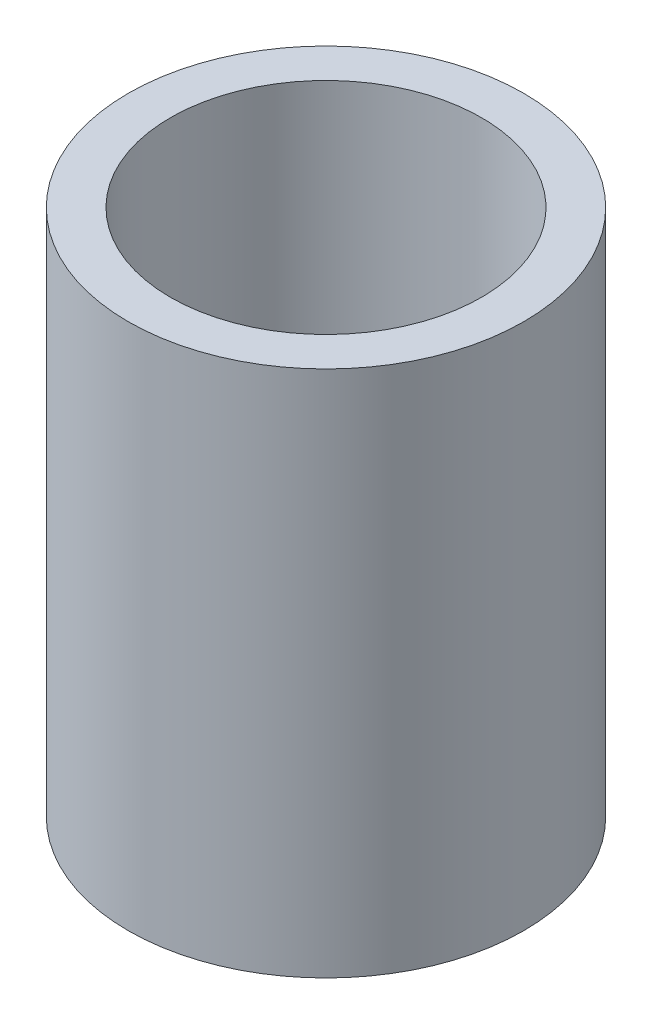
ISO-10303-21;
HEADER;
FILE_DESCRIPTION(('STEP AP214'),'2;1');
FILE_NAME('part.step','',(''),(''),'','','');
FILE_SCHEMA(('AUTOMOTIVE_DESIGN { 1 0 10303 214 1 1 1 1 }'));
ENDSEC;
DATA;
#1=APPLICATION_CONTEXT('core data for automotive mechanical design processes');
#2=APPLICATION_PROTOCOL_DEFINITION('international standard','automotive_design',2000,#1);
#3=PRODUCT_CONTEXT('',#1,'mechanical');
#4=PRODUCT('Part','Part','',(#3));
#5=PRODUCT_RELATED_PRODUCT_CATEGORY('part','',(#4));
#6=PRODUCT_DEFINITION_FORMATION('','',#4);
#7=PRODUCT_DEFINITION_CONTEXT('part definition',#1,'design');
#8=PRODUCT_DEFINITION('design','',#6,#7);
#9=PRODUCT_DEFINITION_SHAPE('','',#8);
#10=(LENGTH_UNIT() NAMED_UNIT(*) SI_UNIT(.MILLI.,.METRE.));
#11=(NAMED_UNIT(*) PLANE_ANGLE_UNIT() SI_UNIT($,.RADIAN.));
#12=(NAMED_UNIT(*) SI_UNIT($,.STERADIAN.) SOLID_ANGLE_UNIT());
#13=UNCERTAINTY_MEASURE_WITH_UNIT(LENGTH_MEASURE(1.E-05),#10,'distance_accuracy_value','');
#14=(GEOMETRIC_REPRESENTATION_CONTEXT(3) GLOBAL_UNCERTAINTY_ASSIGNED_CONTEXT((#13)) GLOBAL_UNIT_ASSIGNED_CONTEXT((#10,
#11,#12)) REPRESENTATION_CONTEXT('',''));
#15=CARTESIAN_POINT('',(0.,0.,0.));
#16=DIRECTION('',(0.,0.,1.));
#17=DIRECTION('',(1.,0.,0.));
#18=AXIS2_PLACEMENT_3D('',#15,#16,#17);
#19=CARTESIAN_POINT('',(0.,5.08,0.));
#20=DIRECTION('',(0.,1.,0.));
#21=DIRECTION('',(0.,0.,1.));
#22=AXIS2_PLACEMENT_3D('',#19,#20,#21);
#23=PLANE('',#22);
#24=CARTESIAN_POINT('',(0.,5.08,0.));
#25=DIRECTION('',(0.,1.,0.));
#26=DIRECTION('',(0.,0.,1.));
#27=AXIS2_PLACEMENT_3D('',#24,#25,#26);
#28=CIRCLE('',#27,1.905);
#29=CARTESIAN_POINT('',(0.,5.08,1.905));
#30=VERTEX_POINT('',#29);
#31=EDGE_CURVE('E10',#30,#30,#28,.T.);
#32=ORIENTED_EDGE('',*,*,#31,.T.);
#33=EDGE_LOOP('',(#32));
#34=FACE_BOUND('',#33,.T.);
#35=CARTESIAN_POINT('',(0.,5.08,0.));
#36=DIRECTION('',(0.,1.,0.));
#37=DIRECTION('',(0.,0.,1.));
#38=AXIS2_PLACEMENT_3D('',#35,#36,#37);
#39=CIRCLE('',#38,1.4986);
#40=CARTESIAN_POINT('',(0.,5.08,1.4986));
#41=VERTEX_POINT('',#40);
#42=EDGE_CURVE('E42',#41,#41,#39,.T.);
#43=ORIENTED_EDGE('',*,*,#42,.F.);
#44=EDGE_LOOP('',(#43));
#45=FACE_BOUND('',#44,.T.);
#46=ADVANCED_FACE('F31',(#34,#45),#23,.T.);
#47=CARTESIAN_POINT('',(0.,0.,0.));
#48=DIRECTION('',(0.,1.,0.));
#49=DIRECTION('',(0.,0.,1.));
#50=AXIS2_PLACEMENT_3D('',#47,#48,#49);
#51=PLANE('',#50);
#52=CARTESIAN_POINT('',(0.,0.,0.));
#53=DIRECTION('',(0.,1.,0.));
#54=DIRECTION('',(0.,0.,1.));
#55=AXIS2_PLACEMENT_3D('',#52,#53,#54);
#56=CIRCLE('',#55,1.905);
#57=CARTESIAN_POINT('',(0.,0.,1.905));
#58=VERTEX_POINT('',#57);
#59=EDGE_CURVE('E35',#58,#58,#56,.T.);
#60=ORIENTED_EDGE('',*,*,#59,.F.);
#61=EDGE_LOOP('',(#60));
#62=FACE_BOUND('',#61,.T.);
#63=CARTESIAN_POINT('',(0.,0.,0.));
#64=DIRECTION('',(0.,1.,0.));
#65=DIRECTION('',(0.,0.,1.));
#66=AXIS2_PLACEMENT_3D('',#63,#64,#65);
#67=CIRCLE('',#66,1.4986);
#68=CARTESIAN_POINT('',(0.,0.,1.4986));
#69=VERTEX_POINT('',#68);
#70=EDGE_CURVE('E44',#69,#69,#67,.T.);
#71=ORIENTED_EDGE('',*,*,#70,.T.);
#72=EDGE_LOOP('',(#71));
#73=FACE_BOUND('',#72,.T.);
#74=ADVANCED_FACE('F54',(#62,#73),#51,.F.);
#75=CARTESIAN_POINT('',(0.,5.08,0.));
#76=DIRECTION('',(0.,-1.,0.));
#77=DIRECTION('',(0.,0.,-1.));
#78=AXIS2_PLACEMENT_3D('',#75,#76,#77);
#79=CYLINDRICAL_SURFACE('',#78,1.905);
#80=ORIENTED_EDGE('',*,*,#31,.F.);
#81=EDGE_LOOP('',(#80));
#82=FACE_BOUND('',#81,.T.);
#83=ORIENTED_EDGE('',*,*,#59,.T.);
#84=EDGE_LOOP('',(#83));
#85=FACE_BOUND('',#84,.T.);
#86=ADVANCED_FACE('F33',(#82,#85),#79,.T.);
#87=CARTESIAN_POINT('',(0.,5.08,0.));
#88=DIRECTION('',(0.,-1.,0.));
#89=DIRECTION('',(0.,0.,-1.));
#90=AXIS2_PLACEMENT_3D('',#87,#88,#89);
#91=CYLINDRICAL_SURFACE('',#90,1.4986);
#92=ORIENTED_EDGE('',*,*,#42,.T.);
#93=EDGE_LOOP('',(#92));
#94=FACE_BOUND('',#93,.T.);
#95=ORIENTED_EDGE('',*,*,#70,.F.);
#96=EDGE_LOOP('',(#95));
#97=FACE_BOUND('',#96,.T.);
#98=ADVANCED_FACE('F50',(#94,#97),#91,.F.);
#99=CLOSED_SHELL('',(#46,#74,#86,#98));
#100=MANIFOLD_SOLID_BREP('B2',#99);
#101=ADVANCED_BREP_SHAPE_REPRESENTATION('',(#18,#100),#14);
#102=SHAPE_DEFINITION_REPRESENTATION(#9,#101);
ENDSEC;
END-ISO-10303-21;
